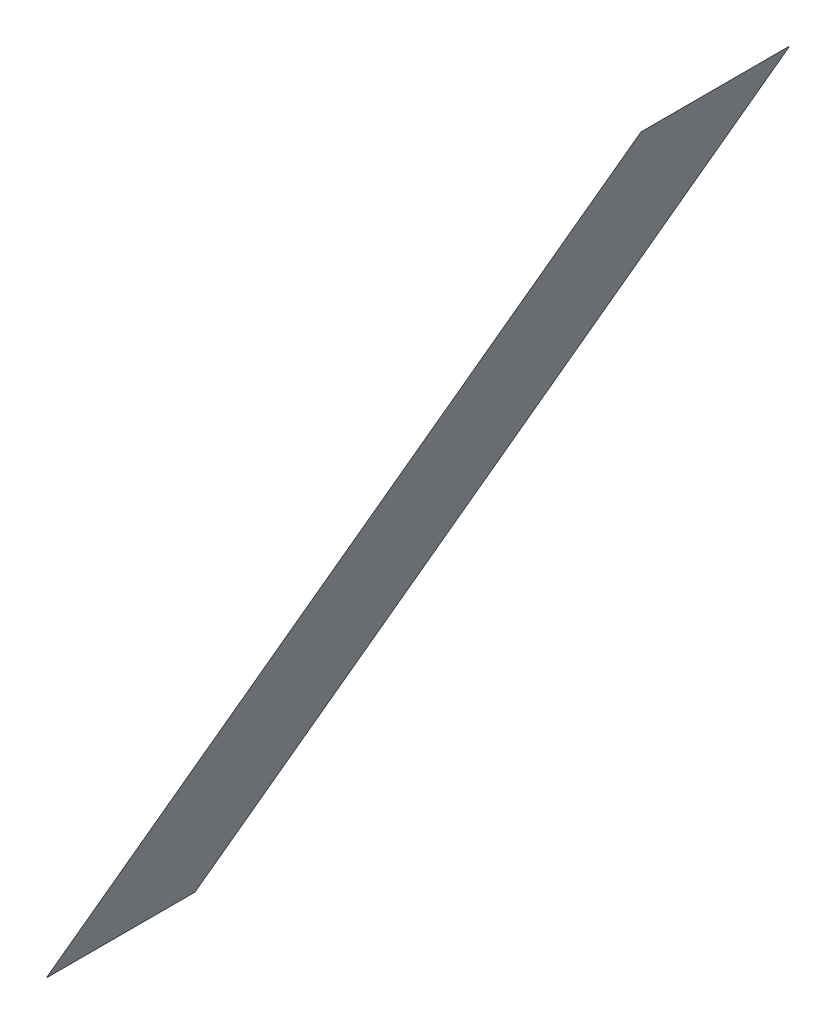
ISO-10303-21;
HEADER;
FILE_DESCRIPTION(('STEP AP214'),'2;1');
FILE_NAME('part.step','',(''),(''),'','','');
FILE_SCHEMA(('AUTOMOTIVE_DESIGN { 1 0 10303 214 1 1 1 1 }'));
ENDSEC;
DATA;
#1=APPLICATION_CONTEXT('core data for automotive mechanical design processes');
#2=APPLICATION_PROTOCOL_DEFINITION('international standard','automotive_design',2000,#1);
#3=PRODUCT_CONTEXT('',#1,'mechanical');
#4=PRODUCT('Part','Part','',(#3));
#5=PRODUCT_RELATED_PRODUCT_CATEGORY('part','',(#4));
#6=PRODUCT_DEFINITION_FORMATION('','',#4);
#7=PRODUCT_DEFINITION_CONTEXT('part definition',#1,'design');
#8=PRODUCT_DEFINITION('design','',#6,#7);
#9=PRODUCT_DEFINITION_SHAPE('','',#8);
#10=(LENGTH_UNIT() NAMED_UNIT(*) SI_UNIT(.MILLI.,.METRE.));
#11=(NAMED_UNIT(*) PLANE_ANGLE_UNIT() SI_UNIT($,.RADIAN.));
#12=(NAMED_UNIT(*) SI_UNIT($,.STERADIAN.) SOLID_ANGLE_UNIT());
#13=UNCERTAINTY_MEASURE_WITH_UNIT(LENGTH_MEASURE(1.E-05),#10,'distance_accuracy_value','');
#14=(GEOMETRIC_REPRESENTATION_CONTEXT(3) GLOBAL_UNCERTAINTY_ASSIGNED_CONTEXT((#13)) GLOBAL_UNIT_ASSIGNED_CONTEXT((#10,
#11,#12)) REPRESENTATION_CONTEXT('',''));
#15=CARTESIAN_POINT('',(0.,0.,0.));
#16=DIRECTION('',(0.,0.,1.));
#17=DIRECTION('',(1.,0.,0.));
#18=AXIS2_PLACEMENT_3D('',#15,#16,#17);
#19=CARTESIAN_POINT('',(127.883127543988,-72.5000319288229,-62.5));
#20=DIRECTION('',(-0.866025410165394,0.499999988947861,0.));
#21=DIRECTION('',(0.,0.,1.));
#22=AXIS2_PLACEMENT_3D('',#19,#20,#21);
#23=PLANE('',#22);
#24=DIRECTION('',(0.,0.,-1.));
#25=VECTOR('',#24,1.);
#26=CARTESIAN_POINT('',(114.944853510818,-94.9097805769914,-163.75));
#27=LINE('',#26,#25);
#28=CARTESIAN_POINT('',(114.944853510818,-94.9097805769914,-260.));
#29=VERTEX_POINT('',#28);
#30=CARTESIAN_POINT('',(114.944853510818,-94.9097805769914,-265.));
#31=VERTEX_POINT('',#30);
#32=EDGE_CURVE('E97',#29,#31,#27,.T.);
#33=ORIENTED_EDGE('',*,*,#32,.F.);
#34=DIRECTION('',(-0.499999988947861,-0.866025410165394,0.));
#35=VECTOR('',#34,1.);
#36=CARTESIAN_POINT('',(172.179452182066,4.22345519411566,-260.));
#37=LINE('',#36,#35);
#38=CARTESIAN_POINT('',(94.9448539529038,-129.550796983607,-260.));
#39=VERTEX_POINT('',#38);
#40=EDGE_CURVE('E101',#29,#39,#37,.T.);
#41=ORIENTED_EDGE('',*,*,#40,.T.);
#42=DIRECTION('',(0.,0.,1.));
#43=VECTOR('',#42,1.);
#44=CARTESIAN_POINT('',(94.9448539529037,-129.550796983607,-163.75));
#45=LINE('',#44,#43);
#46=CARTESIAN_POINT('',(94.9448539529037,-129.550796983607,-265.));
#47=VERTEX_POINT('',#46);
#48=EDGE_CURVE('E141',#47,#39,#45,.T.);
#49=ORIENTED_EDGE('',*,*,#48,.F.);
#50=DIRECTION('',(-0.499999988947861,-0.866025410165394,0.));
#51=VECTOR('',#50,1.);
#52=CARTESIAN_POINT('',(116.413990625163,-92.3651603766651,-265.));
#53=LINE('',#52,#51);
#54=EDGE_CURVE('E11',#31,#47,#53,.T.);
#55=ORIENTED_EDGE('',*,*,#54,.F.);
#56=EDGE_LOOP('',(#33,#41,#49,#55));
#57=FACE_BOUND('',#56,.T.);
#58=ADVANCED_FACE('F48',(#57),#23,.F.);
#59=CARTESIAN_POINT('',(108.408910684416,-114.230262994345,-265.));
#60=DIRECTION('',(0.,0.,1.));
#61=DIRECTION('',(1.,0.,0.));
#62=AXIS2_PLACEMENT_3D('',#59,#60,#61);
#63=PLANE('',#62);
#64=ORIENTED_EDGE('',*,*,#54,.T.);
#65=DIRECTION('',(0.866025403784439,-0.5,0.));
#66=VECTOR('',#65,1.);
#67=CARTESIAN_POINT('',(94.9448109414145,-129.550772150912,-265.));
#68=LINE('',#67,#66);
#69=CARTESIAN_POINT('',(94.9448109414145,-129.550772150912,-265.));
#70=VERTEX_POINT('',#69);
#71=EDGE_CURVE('E56',#70,#47,#68,.T.);
#72=ORIENTED_EDGE('',*,*,#71,.F.);
#73=DIRECTION('',(-0.5,-0.866025403784439,0.));
#74=VECTOR('',#73,1.);
#75=CARTESIAN_POINT('',(114.944810941414,-94.9097559995348,-265.));
#76=LINE('',#75,#74);
#77=CARTESIAN_POINT('',(114.944810941414,-94.9097559995348,-265.));
#78=VERTEX_POINT('',#77);
#79=EDGE_CURVE('E134',#78,#70,#76,.T.);
#80=ORIENTED_EDGE('',*,*,#79,.F.);
#81=DIRECTION('',(-0.866025403784439,0.5,0.));
#82=VECTOR('',#81,1.);
#83=CARTESIAN_POINT('',(121.873010427418,-98.9097538377783,-265.));
#84=LINE('',#83,#82);
#85=EDGE_CURVE('E105',#31,#78,#84,.T.);
#86=ORIENTED_EDGE('',*,*,#85,.F.);
#87=EDGE_LOOP('',(#64,#72,#80,#86));
#88=FACE_BOUND('',#87,.T.);
#89=ADVANCED_FACE('F149',(#88),#63,.F.);
#90=CARTESIAN_POINT('',(94.9448109414145,-129.550772150912,-265.));
#91=DIRECTION('',(-0.5,-0.866025403784438,0.));
#92=DIRECTION('',(-0.866025403784438,0.5,0.));
#93=AXIS2_PLACEMENT_3D('',#90,#91,#92);
#94=PLANE('',#93);
#95=ORIENTED_EDGE('',*,*,#48,.T.);
#96=DIRECTION('',(0.866025403784439,-0.5,0.));
#97=VECTOR('',#96,1.);
#98=CARTESIAN_POINT('',(94.9448109414145,-129.550772150912,-260.));
#99=LINE('',#98,#97);
#100=CARTESIAN_POINT('',(94.9448109414145,-129.550772150912,-260.));
#101=VERTEX_POINT('',#100);
#102=EDGE_CURVE('E106',#101,#39,#99,.T.);
#103=ORIENTED_EDGE('',*,*,#102,.F.);
#104=DIRECTION('',(0.,0.,1.));
#105=VECTOR('',#104,1.);
#106=CARTESIAN_POINT('',(94.9448109414145,-129.550772150912,-265.));
#107=LINE('',#106,#105);
#108=EDGE_CURVE('E138',#70,#101,#107,.T.);
#109=ORIENTED_EDGE('',*,*,#108,.F.);
#110=ORIENTED_EDGE('',*,*,#71,.T.);
#111=EDGE_LOOP('',(#95,#103,#109,#110));
#112=FACE_BOUND('',#111,.T.);
#113=ADVANCED_FACE('F146',(#112),#94,.T.);
#114=CARTESIAN_POINT('',(114.944810941414,-94.9097559995348,-265.));
#115=DIRECTION('',(-0.866025403784438,0.5,0.));
#116=DIRECTION('',(0.,0.,1.));
#117=AXIS2_PLACEMENT_3D('',#114,#115,#116);
#118=PLANE('',#117);
#119=ORIENTED_EDGE('',*,*,#79,.T.);
#120=ORIENTED_EDGE('',*,*,#108,.T.);
#121=DIRECTION('',(-0.5,-0.866025403784439,0.));
#122=VECTOR('',#121,1.);
#123=CARTESIAN_POINT('',(114.944810941414,-94.9097559995348,-260.));
#124=LINE('',#123,#122);
#125=CARTESIAN_POINT('',(114.944810941414,-94.9097559995348,-260.));
#126=VERTEX_POINT('',#125);
#127=EDGE_CURVE('E117',#126,#101,#124,.T.);
#128=ORIENTED_EDGE('',*,*,#127,.F.);
#129=DIRECTION('',(0.,0.,1.));
#130=VECTOR('',#129,1.);
#131=CARTESIAN_POINT('',(114.944810941414,-94.9097559995348,-265.));
#132=LINE('',#131,#130);
#133=EDGE_CURVE('E112',#78,#126,#132,.T.);
#134=ORIENTED_EDGE('',*,*,#133,.F.);
#135=EDGE_LOOP('',(#119,#120,#128,#134));
#136=FACE_BOUND('',#135,.T.);
#137=ADVANCED_FACE('F148',(#136),#118,.T.);
#138=CARTESIAN_POINT('',(121.873010427418,-98.9097538377783,-265.));
#139=DIRECTION('',(0.5,0.866025403784438,0.));
#140=DIRECTION('',(0.,0.,-1.));
#141=AXIS2_PLACEMENT_3D('',#138,#139,#140);
#142=PLANE('',#141);
#143=ORIENTED_EDGE('',*,*,#32,.T.);
#144=ORIENTED_EDGE('',*,*,#85,.T.);
#145=ORIENTED_EDGE('',*,*,#133,.T.);
#146=DIRECTION('',(-0.866025403784439,0.5,0.));
#147=VECTOR('',#146,1.);
#148=CARTESIAN_POINT('',(121.873010427418,-98.9097538377783,-260.));
#149=LINE('',#148,#147);
#150=EDGE_CURVE('E109',#29,#126,#149,.T.);
#151=ORIENTED_EDGE('',*,*,#150,.F.);
#152=EDGE_LOOP('',(#143,#144,#145,#151));
#153=FACE_BOUND('',#152,.T.);
#154=ADVANCED_FACE('F110',(#153),#142,.T.);
#155=CARTESIAN_POINT('',(108.408910684416,-114.230262994345,-260.));
#156=DIRECTION('',(0.,0.,1.));
#157=DIRECTION('',(1.,0.,0.));
#158=AXIS2_PLACEMENT_3D('',#155,#156,#157);
#159=PLANE('',#158);
#160=ORIENTED_EDGE('',*,*,#40,.F.);
#161=ORIENTED_EDGE('',*,*,#150,.T.);
#162=ORIENTED_EDGE('',*,*,#127,.T.);
#163=ORIENTED_EDGE('',*,*,#102,.T.);
#164=EDGE_LOOP('',(#160,#161,#162,#163));
#165=FACE_BOUND('',#164,.T.);
#166=ADVANCED_FACE('F120',(#165),#159,.T.);
#167=CLOSED_SHELL('',(#58,#89,#113,#137,#154,#166));
#168=MANIFOLD_SOLID_BREP('B2',#167);
#169=ADVANCED_BREP_SHAPE_REPRESENTATION('',(#18,#168),#14);
#170=SHAPE_DEFINITION_REPRESENTATION(#9,#169);
ENDSEC;
END-ISO-10303-21;
